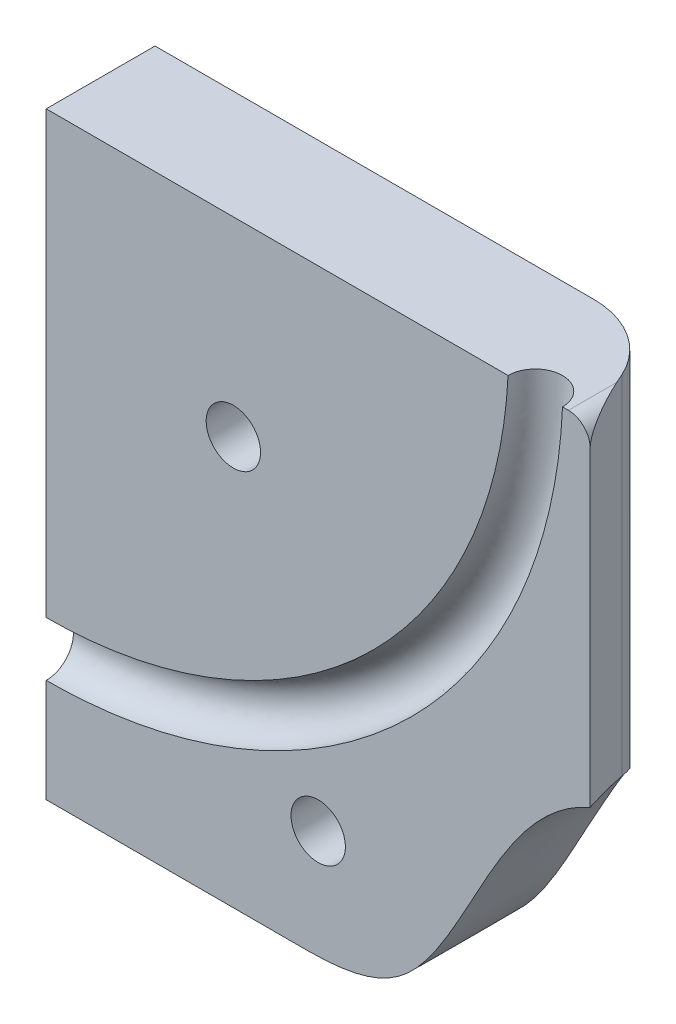
ISO-10303-21;
HEADER;
FILE_DESCRIPTION(('STEP AP214'),'2;1');
FILE_NAME('part.step','',(''),(''),'','','');
FILE_SCHEMA(('AUTOMOTIVE_DESIGN { 1 0 10303 214 1 1 1 1 }'));
ENDSEC;
DATA;
#1=APPLICATION_CONTEXT('core data for automotive mechanical design processes');
#2=APPLICATION_PROTOCOL_DEFINITION('international standard','automotive_design',2000,#1);
#3=PRODUCT_CONTEXT('',#1,'mechanical');
#4=PRODUCT('Part','Part','',(#3));
#5=PRODUCT_RELATED_PRODUCT_CATEGORY('part','',(#4));
#6=PRODUCT_DEFINITION_FORMATION('','',#4);
#7=PRODUCT_DEFINITION_CONTEXT('part definition',#1,'design');
#8=PRODUCT_DEFINITION('design','',#6,#7);
#9=PRODUCT_DEFINITION_SHAPE('','',#8);
#10=(LENGTH_UNIT() NAMED_UNIT(*) SI_UNIT(.MILLI.,.METRE.));
#11=(NAMED_UNIT(*) PLANE_ANGLE_UNIT() SI_UNIT($,.RADIAN.));
#12=(NAMED_UNIT(*) SI_UNIT($,.STERADIAN.) SOLID_ANGLE_UNIT());
#13=UNCERTAINTY_MEASURE_WITH_UNIT(LENGTH_MEASURE(1.E-05),#10,'distance_accuracy_value','');
#14=(GEOMETRIC_REPRESENTATION_CONTEXT(3) GLOBAL_UNCERTAINTY_ASSIGNED_CONTEXT((#13)) GLOBAL_UNIT_ASSIGNED_CONTEXT((#10,
#11,#12)) REPRESENTATION_CONTEXT('',''));
#15=CARTESIAN_POINT('',(0.,0.,0.));
#16=DIRECTION('',(0.,0.,1.));
#17=DIRECTION('',(1.,0.,0.));
#18=AXIS2_PLACEMENT_3D('',#15,#16,#17);
#19=CARTESIAN_POINT('',(38.2647547534457,10.0098254795269,0.));
#20=DIRECTION('',(0.,0.,1.));
#21=DIRECTION('',(-1.,0.,0.));
#22=AXIS2_PLACEMENT_3D('',#19,#20,#21);
#23=PLANE('',#22);
#24=CARTESIAN_POINT('',(17.2,37.5,0.));
#25=DIRECTION('',(0.,0.,-1.));
#26=DIRECTION('',(-1.,0.,0.));
#27=AXIS2_PLACEMENT_3D('',#24,#25,#26);
#28=CIRCLE('',#27,2.5000000000842);
#29=CARTESIAN_POINT('',(14.6999999999158,37.5,0.));
#30=VERTEX_POINT('',#29);
#31=EDGE_CURVE('E201',#30,#30,#28,.F.);
#32=ORIENTED_EDGE('',*,*,#31,.F.);
#33=EDGE_LOOP('',(#32));
#34=FACE_BOUND('',#33,.T.);
#35=CARTESIAN_POINT('',(42.5,57.,0.));
#36=CARTESIAN_POINT('',(42.5000000006538,51.9253380487951,0.));
#37=CARTESIAN_POINT('',(41.5531151539756,46.4013222350396,0.));
#38=CARTESIAN_POINT('',(38.3409411286107,38.4417646806979,0.));
#39=CARTESIAN_POINT('',(36.973235797455,35.8352441280092,0.));
#40=CARTESIAN_POINT('',(33.6915817568519,30.9261746060751,0.));
#41=CARTESIAN_POINT('',(31.771503076357,28.6150238978217,0.));
#42=CARTESIAN_POINT('',(27.4982759398184,24.4580256174074,0.));
#43=CARTESIAN_POINT('',(25.1383219375729,22.6054937700866,0.));
#44=CARTESIAN_POINT('',(20.1558797146555,19.4679096422306,0.));
#45=CARTESIAN_POINT('',(17.5261590397284,18.1774846024586,0.));
#46=CARTESIAN_POINT('',(12.1919874742694,16.1868966847282,0.));
#47=CARTESIAN_POINT('',(9.47903854419933,15.4827671330933,0.));
#48=CARTESIAN_POINT('',(4.15156445206141,14.6172527598869,0.));
#49=CARTESIAN_POINT('',(1.52516480725778,14.4582368787778,0.));
#50=CARTESIAN_POINT('',(-1.00015293756699,14.5108584228348,0.));
#51=B_SPLINE_CURVE_WITH_KNOTS('',3,(#35,#36,#37,#38,#39,#40,#41,#42,#43,#44,#45,#46,#47,#48,#49,
#50),.UNSPECIFIED.,.F.,.F.,(4,2,2,2,2,2,2,4),(0.,0.25,0.375,0.5,0.625,0.75,0.875,1.),.UNSPECIFIED.);
#52=CARTESIAN_POINT('',(0.,14.5012176124524,0.));
#53=VERTEX_POINT('',#52);
#54=CARTESIAN_POINT('',(42.4514698092519,55.,0.));
#55=VERTEX_POINT('',#54);
#56=EDGE_CURVE('E161',#53,#55,#51,.F.);
#57=ORIENTED_EDGE('',*,*,#56,.T.);
#58=DIRECTION('',(-1.,0.,0.));
#59=VECTOR('',#58,1.);
#60=CARTESIAN_POINT('',(0.,55.,0.));
#61=LINE('',#60,#59);
#62=CARTESIAN_POINT('',(0.,55.,0.));
#63=VERTEX_POINT('',#62);
#64=EDGE_CURVE('E118',#55,#63,#61,.T.);
#65=ORIENTED_EDGE('',*,*,#64,.T.);
#66=DIRECTION('',(0.,-1.,0.));
#67=VECTOR('',#66,1.);
#68=CARTESIAN_POINT('',(0.,0.,0.));
#69=LINE('',#68,#67);
#70=EDGE_CURVE('E145',#63,#53,#69,.T.);
#71=ORIENTED_EDGE('',*,*,#70,.T.);
#72=EDGE_LOOP('',(#57,#65,#71));
#73=FACE_BOUND('',#72,.T.);
#74=ADVANCED_FACE('F33',(#34,#73),#23,.T.);
#75=CARTESIAN_POINT('',(0.,0.,-10.));
#76=DIRECTION('',(0.,1.,0.));
#77=DIRECTION('',(0.,0.,-1.));
#78=AXIS2_PLACEMENT_3D('',#75,#76,#77);
#79=PLANE('',#78);
#80=DIRECTION('',(1.,0.,0.));
#81=VECTOR('',#80,1.);
#82=CARTESIAN_POINT('',(0.,0.,0.));
#83=LINE('',#82,#81);
#84=CARTESIAN_POINT('',(0.,0.,0.));
#85=VERTEX_POINT('',#84);
#86=CARTESIAN_POINT('',(24.,0.,0.));
#87=VERTEX_POINT('',#86);
#88=EDGE_CURVE('E131',#85,#87,#83,.T.);
#89=ORIENTED_EDGE('',*,*,#88,.F.);
#90=DIRECTION('',(0.,0.,1.));
#91=VECTOR('',#90,1.);
#92=CARTESIAN_POINT('',(0.,0.,-10.));
#93=LINE('',#92,#91);
#94=CARTESIAN_POINT('',(0.,0.,-10.));
#95=VERTEX_POINT('',#94);
#96=EDGE_CURVE('E149',#95,#85,#93,.T.);
#97=ORIENTED_EDGE('',*,*,#96,.F.);
#98=DIRECTION('',(1.,0.,0.));
#99=VECTOR('',#98,1.);
#100=CARTESIAN_POINT('',(0.,0.,-10.));
#101=LINE('',#100,#99);
#102=CARTESIAN_POINT('',(24.,0.,-10.));
#103=VERTEX_POINT('',#102);
#104=EDGE_CURVE('E148',#95,#103,#101,.T.);
#105=ORIENTED_EDGE('',*,*,#104,.T.);
#106=DIRECTION('',(0.,0.,1.));
#107=VECTOR('',#106,1.);
#108=CARTESIAN_POINT('',(24.,0.,-10.));
#109=LINE('',#108,#107);
#110=EDGE_CURVE('E155',#103,#87,#109,.T.);
#111=ORIENTED_EDGE('',*,*,#110,.T.);
#112=EDGE_LOOP('',(#89,#97,#105,#111));
#113=FACE_BOUND('',#112,.T.);
#114=ADVANCED_FACE('F248',(#113),#79,.F.);
#115=CARTESIAN_POINT('',(24.,0.,-10.));
#116=CARTESIAN_POINT('',(29.8352147172741,0.,-10.));
#117=CARTESIAN_POINT('',(38.1427017924434,5.23965862310339,-10.));
#118=CARTESIAN_POINT('',(42.219386104431,21.0249690236079,-10.));
#119=CARTESIAN_POINT('',(50.,24.39,-10.));
#120=B_SPLINE_CURVE_WITH_KNOTS('',3,(#115,#116,#117,#118,#119),.UNSPECIFIED.,.F.,.F.,(4,1,4),
(0.,0.308376464465962,1.),.UNSPECIFIED.);
#121=DIRECTION('',(0.,0.,1.));
#122=VECTOR('',#121,1.);
#123=SURFACE_OF_LINEAR_EXTRUSION('',#120,#122);
#124=CARTESIAN_POINT('',(40.3273151174776,13.7686554590392,-10.));
#125=VERTEX_POINT('',#124);
#126=EDGE_CURVE('E249',#103,#125,#120,.T.);
#127=ORIENTED_EDGE('',*,*,#126,.T.);
#128=CARTESIAN_POINT('',(40.3273151202155,13.7686554575069,-10.));
#129=CARTESIAN_POINT('',(40.4467285588433,13.9820245100957,-9.99998126805955));
#130=CARTESIAN_POINT('',(40.5668640420407,14.1950035748302,-9.99732535118046));
#131=CARTESIAN_POINT('',(40.8093358759297,14.6205184449713,-9.98639567757893));
#132=CARTESIAN_POINT('',(40.931678322104,14.833050279482,-9.97810284564586));
#133=CARTESIAN_POINT('',(41.1787522298561,15.2569606691702,-9.95552967897624));
#134=CARTESIAN_POINT('',(41.3034878570959,15.4683361959591,-9.94123778637958));
#135=CARTESIAN_POINT('',(41.5555293860955,15.8892118410067,-9.90618086646873));
#136=CARTESIAN_POINT('',(41.6828369799004,16.0987105845027,-9.88541143882596));
#137=CARTESIAN_POINT('',(41.9430890324445,16.5197922078681,-9.83627453652074));
#138=CARTESIAN_POINT('',(42.0760958876754,16.7313183332073,-9.80774883139704));
#139=CARTESIAN_POINT('',(42.3451692532027,17.1509179914526,-9.74257147194688));
#140=CARTESIAN_POINT('',(42.4812332014135,17.3589941788515,-9.70592640961936));
#141=CARTESIAN_POINT('',(42.7565717045996,17.7709289243029,-9.6236042420385));
#142=CARTESIAN_POINT('',(42.8958431236252,17.9747912605905,-9.57793565338594));
#143=CARTESIAN_POINT('',(43.1777048692401,18.3775240692896,-9.47647666980652));
#144=CARTESIAN_POINT('',(43.3202936282172,18.5763968107682,-9.42069097431611));
#145=CARTESIAN_POINT('',(43.6134257916959,18.9745965608049,-9.29573064830759));
#146=CARTESIAN_POINT('',(43.7640770032242,19.1737272412102,-9.22617899429437));
#147=CARTESIAN_POINT('',(44.0684406202107,19.5643439887571,-9.07339906649159));
#148=CARTESIAN_POINT('',(44.2221533476893,19.7558292452952,-8.99016934725068));
#149=CARTESIAN_POINT('',(44.5310410437315,20.1286635567275,-8.80886176008807));
#150=CARTESIAN_POINT('',(44.6862051179849,20.310057788981,-8.71085885044324));
#151=CARTESIAN_POINT('',(44.9974086704417,20.6619892371722,-8.49813263635197));
#152=CARTESIAN_POINT('',(45.1534479608748,20.8325286917407,-8.38341279567371));
#153=CARTESIAN_POINT('',(45.4403251212698,21.1354345853722,-8.15510373777022));
#154=CARTESIAN_POINT('',(45.5713108686385,21.2696145956098,-8.0441095140563));
#155=CARTESIAN_POINT('',(45.8310700266159,21.5279021152313,-7.80856342759619));
#156=CARTESIAN_POINT('',(45.9598434408666,21.6520096411982,-7.68401158717151));
#157=CARTESIAN_POINT('',(46.2132594758109,21.8890514959839,-7.42115780564348));
#158=CARTESIAN_POINT('',(46.337905926975,22.0019963904821,-7.28286912030821));
#159=CARTESIAN_POINT('',(46.5811645387497,22.2160292404636,-6.99251437516786));
#160=CARTESIAN_POINT('',(46.6997784366572,22.3171206206791,-6.84045231739974));
#161=CARTESIAN_POINT('',(46.8904135831682,22.4750661538659,-6.57631629973108));
#162=CARTESIAN_POINT('',(46.9647190695841,22.5353856095659,-6.46793567994489));
#163=CARTESIAN_POINT('',(47.1091025043075,22.6504620048562,-6.24557704218207));
#164=CARTESIAN_POINT('',(47.1791814042466,22.7052201984987,-6.13160029475764));
#165=CARTESIAN_POINT('',(47.3147006182162,22.8092814536906,-5.89803918517384));
#166=CARTESIAN_POINT('',(47.3801278569312,22.8585693410513,-5.7784404732983));
#167=CARTESIAN_POINT('',(47.5055960816484,22.9515567113142,-5.53428625440431));
#168=CARTESIAN_POINT('',(47.5656351265772,22.9952541826866,-5.40972898422809));
#169=CARTESIAN_POINT('',(47.6226871616163,23.0361576650075,-5.28291741863039));
#170=B_SPLINE_CURVE_WITH_KNOTS('',3,(#128,#129,#130,#131,#132,#133,#134,#135,#136,#137,#138,
#139,#140,#141,#142,#143,#144,#145,#146,#147,#148,#149,#150,#151,#152,#153,#154,#155,#156,#157,
#158,#159,#160,#161,#162,#163,#164,#165,#166,#167,#168,#169),.UNSPECIFIED.,.F.,.F.,(4,2,2,2,2,2,
2,2,2,2,2,2,2,2,2,2,2,2,2,2,4),(0.,0.733537810530458,1.46957033832542,2.20702747125606,
2.94498666987134,3.6993053316924,4.45301380172933,5.20601427435247,5.95866586696809,
6.73584086058093,7.51309803627344,8.28653652963438,9.05981499288392,9.71291916050243,
10.3660222528546,11.0185011262161,11.6707910176208,12.1043091195951,12.5377292461287,
12.9723230845311,13.4070728602437),.UNSPECIFIED.);
#171=CARTESIAN_POINT('',(47.6226871616163,23.0361576650075,-5.28291741863038));
#172=VERTEX_POINT('',#171);
#173=EDGE_CURVE('E11',#125,#172,#170,.T.);
#174=ORIENTED_EDGE('',*,*,#173,.T.);
#175=CARTESIAN_POINT('',(50.,24.39,0.));
#176=CARTESIAN_POINT('',(49.8711470832192,24.3342734517914,-0.286339815068479));
#177=CARTESIAN_POINT('',(49.7424810321156,24.2759661271607,-0.572264373076557));
#178=CARTESIAN_POINT('',(49.4857811495244,24.1541679793347,-1.14270855661241));
#179=CARTESIAN_POINT('',(49.3577466284827,24.0906857826721,-1.42722971448298));
#180=CARTESIAN_POINT('',(49.1023200134816,23.9584242603145,-1.99484441448534));
#181=CARTESIAN_POINT('',(48.9749272840933,23.8896522290607,-2.27793936868167));
#182=CARTESIAN_POINT('',(48.720794981955,23.7467006581557,-2.84267781787781));
#183=CARTESIAN_POINT('',(48.594054862088,23.6725268974887,-3.12432252869343));
#184=CARTESIAN_POINT('',(48.341238080692,23.5186635100879,-3.6861375984622));
#185=CARTESIAN_POINT('',(48.2151610009308,23.4389779664948,-3.9663088868205));
#186=CARTESIAN_POINT('',(47.9636802960152,23.2739863505393,-4.5251548977439));
#187=CARTESIAN_POINT('',(47.8382764266694,23.188682489425,-4.8038301629568));
#188=CARTESIAN_POINT('',(47.5881267216213,23.0123367967133,-5.35971839639712));
#189=CARTESIAN_POINT('',(47.4633810005463,22.9212939991558,-5.63693110989712));
#190=CARTESIAN_POINT('',(47.2145868725048,22.7333960670775,-6.18980694998936));
#191=CARTESIAN_POINT('',(47.0905386902949,22.6365391647553,-6.4654695771225));
#192=CARTESIAN_POINT('',(46.8431515821448,22.4369311811063,-7.0152187063448));
#193=CARTESIAN_POINT('',(46.7198131838181,22.3341762157254,-7.28930403595982));
#194=CARTESIAN_POINT('',(46.4738559992845,22.1227010482246,-7.83587555714547));
#195=CARTESIAN_POINT('',(46.3512380962562,22.0139747452747,-8.10835978609737));
#196=CARTESIAN_POINT('',(46.106730752299,21.7904962333877,-8.65170943933555));
#197=CARTESIAN_POINT('',(45.9848426011073,21.6757356440696,-8.92257199753941));
#198=CARTESIAN_POINT('',(45.7418003955538,21.4401493623928,-9.46266578765821));
#199=CARTESIAN_POINT('',(45.6206480810897,21.3193130112043,-9.73189315313395));
#200=CARTESIAN_POINT('',(45.5,21.1955568219506,-10.));
#201=B_SPLINE_CURVE_WITH_KNOTS('',3,(#175,#176,#177,#178,#179,#180,#181,#182,#183,#184,#185,
#186,#187,#188,#189,#190,#191,#192,#193,#194,#195,#196,#197,#198,#199,#200),.UNSPECIFIED.,.F.,
.F.,(4,2,2,2,2,2,2,2,2,2,2,2,4),(0.,0.956701567146893,1.91183970271127,2.86568357783072,
3.81852157406886,4.77066111326431,5.72242812480572,6.67435576481001,7.62657432279897,
8.57942730483532,9.53327259982554,10.4884795019383,11.4454249609775),.UNSPECIFIED.);
#202=CARTESIAN_POINT('',(50.,24.39,0.));
#203=VERTEX_POINT('',#202);
#204=EDGE_CURVE('E111',#203,#172,#201,.T.);
#205=ORIENTED_EDGE('',*,*,#204,.F.);
#206=CARTESIAN_POINT('',(24.,0.,0.));
#207=CARTESIAN_POINT('',(29.8352147172741,0.,0.));
#208=CARTESIAN_POINT('',(38.1427017924434,5.23965862310339,0.));
#209=CARTESIAN_POINT('',(42.219386104431,21.0249690236079,0.));
#210=CARTESIAN_POINT('',(50.,24.39,0.));
#211=B_SPLINE_CURVE_WITH_KNOTS('',3,(#206,#207,#208,#209,#210),.UNSPECIFIED.,.F.,.F.,(4,1,4),
(0.,0.308376464465962,1.),.UNSPECIFIED.);
#212=EDGE_CURVE('E119',#87,#203,#211,.T.);
#213=ORIENTED_EDGE('',*,*,#212,.F.);
#214=ORIENTED_EDGE('',*,*,#110,.F.);
#215=EDGE_LOOP('',(#127,#174,#205,#213,#214));
#216=FACE_BOUND('',#215,.T.);
#217=ADVANCED_FACE('F122',(#216),#123,.T.);
#218=CARTESIAN_POINT('',(0.,55.,-10.));
#219=DIRECTION('',(0.,-1.,0.));
#220=DIRECTION('',(0.,0.,1.));
#221=AXIS2_PLACEMENT_3D('',#218,#219,#220);
#222=PLANE('',#221);
#223=DIRECTION('',(0.410364677328798,0.,0.911921505175106));
#224=VECTOR('',#223,1.);
#225=CARTESIAN_POINT('',(50.,55.,0.));
#226=LINE('',#225,#224);
#227=CARTESIAN_POINT('',(47.6226871616163,55.,-5.28291741863038));
#228=VERTEX_POINT('',#227);
#229=CARTESIAN_POINT('',(48.,55.,-4.44444444444445));
#230=VERTEX_POINT('',#229);
#231=EDGE_CURVE('E126',#228,#230,#226,.T.);
#232=ORIENTED_EDGE('',*,*,#231,.F.);
#233=CARTESIAN_POINT('',(40.3273151202155,55.,-2.));
#234=DIRECTION('',(0.,-1.,0.));
#235=DIRECTION('',(0.,0.,-1.));
#236=AXIS2_PLACEMENT_3D('',#233,#234,#235);
#237=CIRCLE('',#236,8.);
#238=CARTESIAN_POINT('',(40.3273151202155,55.,-10.));
#239=VERTEX_POINT('',#238);
#240=EDGE_CURVE('E60',#228,#239,#237,.F.);
#241=ORIENTED_EDGE('',*,*,#240,.T.);
#242=DIRECTION('',(-1.,0.,0.));
#243=VECTOR('',#242,1.);
#244=CARTESIAN_POINT('',(0.,55.,-10.));
#245=LINE('',#244,#243);
#246=CARTESIAN_POINT('',(0.,55.,-10.));
#247=VERTEX_POINT('',#246);
#248=EDGE_CURVE('E254',#239,#247,#245,.T.);
#249=ORIENTED_EDGE('',*,*,#248,.T.);
#250=DIRECTION('',(0.,0.,1.));
#251=VECTOR('',#250,1.);
#252=CARTESIAN_POINT('',(0.,55.,-10.));
#253=LINE('',#252,#251);
#254=EDGE_CURVE('E152',#247,#63,#253,.T.);
#255=ORIENTED_EDGE('',*,*,#254,.T.);
#256=ORIENTED_EDGE('',*,*,#64,.F.);
#257=CARTESIAN_POINT('',(47.4568555946469,55.,0.));
#258=CARTESIAN_POINT('',(47.4568623708793,55.,-0.0702648939159161));
#259=CARTESIAN_POINT('',(47.4538904852355,55.,-0.140526573017456));
#260=CARTESIAN_POINT('',(47.442041824152,55.,-0.280546893510559));
#261=CARTESIAN_POINT('',(47.4331653421898,55.,-0.350305559729305));
#262=CARTESIAN_POINT('',(47.40956851912,55.,-0.488779823353157));
#263=CARTESIAN_POINT('',(47.3948524440054,55.,-0.557496144259975));
#264=CARTESIAN_POINT('',(47.3596963979197,55.,-0.693427968661049));
#265=CARTESIAN_POINT('',(47.3392564945323,55.,-0.760643489865761));
#266=CARTESIAN_POINT('',(47.2695183998098,55.,-0.959387102448081));
#267=CARTESIAN_POINT('',(47.211791561359,55.,-1.08807213968848));
#268=CARTESIAN_POINT('',(47.0756008847293,55.,-1.33383292830919));
#269=CARTESIAN_POINT('',(46.997140974646,55.,-1.45091087300155));
#270=CARTESIAN_POINT('',(46.8216505600416,55.,-1.67031486399083));
#271=CARTESIAN_POINT('',(46.7246120514826,55.,-1.77263451868155));
#272=CARTESIAN_POINT('',(46.5147354203153,55.,-1.95955877369636));
#273=CARTESIAN_POINT('',(46.4018948401067,55.,-2.04416061335896));
#274=CARTESIAN_POINT('',(46.1635226103419,55.,-2.19331465627374));
#275=CARTESIAN_POINT('',(46.0379799845037,55.,-2.25784931923312));
#276=CARTESIAN_POINT('',(45.7778572992051,55.,-2.36494364852608));
#277=CARTESIAN_POINT('',(45.643277768906,55.,-2.40750460027749));
#278=CARTESIAN_POINT('',(45.3687580828219,55.,-2.46949108001671));
#279=CARTESIAN_POINT('',(45.2288129372254,55.,-2.48889450599971));
#280=CARTESIAN_POINT('',(44.947642919291,55.,-2.50394296510746));
#281=CARTESIAN_POINT('',(44.806418012416,55.,-2.4995873551264));
#282=CARTESIAN_POINT('',(44.5266412821531,55.,-2.46724523838534));
#283=CARTESIAN_POINT('',(44.388090963704,55.,-2.43924580259765));
#284=CARTESIAN_POINT('',(44.1175940612239,55.,-2.36033921992151));
#285=CARTESIAN_POINT('',(43.9856474598996,55.,-2.30943213302506));
#286=CARTESIAN_POINT('',(43.7956666437165,55.,-2.21708326981605));
#287=CARTESIAN_POINT('',(43.7336358513023,55.,-2.18361629528253));
#288=CARTESIAN_POINT('',(43.6126124845674,55.,-2.11157533993583));
#289=CARTESIAN_POINT('',(43.55361920705,55.,-2.0730025485901));
#290=CARTESIAN_POINT('',(43.4391207612037,55.,-1.99103592660528));
#291=CARTESIAN_POINT('',(43.3836141388032,55.,-1.94764412686189));
#292=CARTESIAN_POINT('',(43.2764126780997,55.,-1.85630635516975));
#293=CARTESIAN_POINT('',(43.2247215862654,55.,-1.80835601013701));
#294=CARTESIAN_POINT('',(43.0761476337713,55.,-1.65834509604768));
#295=CARTESIAN_POINT('',(42.9855203926245,55.,-1.54994981940076));
#296=CARTESIAN_POINT('',(42.8238082500325,55.,-1.31945513463973));
#297=CARTESIAN_POINT('',(42.7527224116425,55.,-1.1973563839568));
#298=CARTESIAN_POINT('',(42.6622758114028,55.,-1.00667789322266));
#299=CARTESIAN_POINT('',(42.6348147232992,55.,-0.941830549025652));
#300=CARTESIAN_POINT('',(42.5854750549876,55.,-0.810087020293698));
#301=CARTESIAN_POINT('',(42.5635919564041,55.,-0.743192543529586));
#302=CARTESIAN_POINT('',(42.5255682313005,55.,-0.607869056184087));
#303=CARTESIAN_POINT('',(42.509421937976,55.,-0.53944163129186));
#304=CARTESIAN_POINT('',(42.4829572604698,55.,-0.401481732782834));
#305=CARTESIAN_POINT('',(42.4726371580063,55.,-0.331949591199617));
#306=CARTESIAN_POINT('',(42.460666972768,55.,-0.21855461096321));
#307=CARTESIAN_POINT('',(42.4572158538575,55.,-0.174873913796269));
#308=CARTESIAN_POINT('',(42.4526189346255,55.,-0.0874636896438956));
#309=CARTESIAN_POINT('',(42.4514693388725,55.,-0.0437343622368296));
#310=CARTESIAN_POINT('',(42.4514698092519,55.,0.));
#311=B_SPLINE_CURVE_WITH_KNOTS('',3,(#257,#258,#259,#260,#261,#262,#263,#264,#265,#266,#267,
#268,#269,#270,#271,#272,#273,#274,#275,#276,#277,#278,#279,#280,#281,#282,#283,#284,#285,#286,
#287,#288,#289,#290,#291,#292,#293,#294,#295,#296,#297,#298,#299,#300,#301,#302,#303,#304,#305,
#306,#307,#308,#309,#310),.UNSPECIFIED.,.F.,.F.,(4,2,2,2,2,2,2,2,2,2,2,2,2,2,2,2,2,2,2,2,2,2,2,
2,2,2,4),(0.,0.210726062439781,0.421441651895574,0.632003590030021,0.842563042076186,
1.26350193366707,1.68436113112706,2.10540205295756,2.52650852960349,2.94798205847605,
3.36943092920193,3.79128171829109,4.21314392602706,4.6352369679275,5.05732890443031,
5.26857170865013,5.47976538739624,5.69087039721725,5.90218000719581,6.32391093804175,
6.74562164477232,6.95667878086567,7.16756440573312,7.37824113524605,7.58885569869703,
7.72025052778673,7.85142849517873),.UNSPECIFIED.);
#312=CARTESIAN_POINT('',(47.4568555946469,55.,0.));
#313=VERTEX_POINT('',#312);
#314=EDGE_CURVE('E133',#313,#55,#311,.T.);
#315=ORIENTED_EDGE('',*,*,#314,.F.);
#316=CARTESIAN_POINT('',(48.,55.,0.));
#317=VERTEX_POINT('',#316);
#318=EDGE_CURVE('E142',#317,#313,#61,.T.);
#319=ORIENTED_EDGE('',*,*,#318,.F.);
#320=DIRECTION('',(0.,0.,1.));
#321=VECTOR('',#320,1.);
#322=CARTESIAN_POINT('',(48.,55.,-10.));
#323=LINE('',#322,#321);
#324=EDGE_CURVE('E179',#317,#230,#323,.F.);
#325=ORIENTED_EDGE('',*,*,#324,.T.);
#326=EDGE_LOOP('',(#232,#241,#249,#255,#256,#315,#319,#325));
#327=FACE_BOUND('',#326,.T.);
#328=ADVANCED_FACE('F186',(#327),#222,.F.);
#329=CARTESIAN_POINT('',(0.,0.,-10.));
#330=DIRECTION('',(1.,0.,0.));
#331=DIRECTION('',(0.,0.,1.));
#332=AXIS2_PLACEMENT_3D('',#329,#330,#331);
#333=PLANE('',#332);
#334=ORIENTED_EDGE('',*,*,#70,.F.);
#335=ORIENTED_EDGE('',*,*,#254,.F.);
#336=DIRECTION('',(0.,-1.,0.));
#337=VECTOR('',#336,1.);
#338=CARTESIAN_POINT('',(0.,0.,-10.));
#339=LINE('',#338,#337);
#340=EDGE_CURVE('E153',#247,#95,#339,.T.);
#341=ORIENTED_EDGE('',*,*,#340,.T.);
#342=ORIENTED_EDGE('',*,*,#96,.T.);
#343=CARTESIAN_POINT('',(0.,9.50123213656066,0.));
#344=VERTEX_POINT('',#343);
#345=EDGE_CURVE('E144',#344,#85,#69,.T.);
#346=ORIENTED_EDGE('',*,*,#345,.F.);
#347=CARTESIAN_POINT('',(-2.67825041658232E-13,9.50123213656066,0.));
#348=CARTESIAN_POINT('',(0.,9.50122540068782,-0.070314845686527));
#349=CARTESIAN_POINT('',(0.,9.50419861037009,-0.14062649626872));
#350=CARTESIAN_POINT('',(0.,9.5160527904368,-0.280746762836435));
#351=CARTESIAN_POINT('',(0.,9.52493347798262,-0.350555402743394));
#352=CARTESIAN_POINT('',(0.,9.54854219323776,-0.48913111560415));
#353=CARTESIAN_POINT('',(0.,9.56326610684729,-0.557898886123407));
#354=CARTESIAN_POINT('',(0.,9.59844182404334,-0.693932821425435));
#355=CARTESIAN_POINT('',(0.,9.61889355801923,-0.761199004446385));
#356=CARTESIAN_POINT('',(0.,9.68867455696585,-0.960093953412169));
#357=CARTESIAN_POINT('',(0.,9.74643966872951,-1.08887779485323));
#358=CARTESIAN_POINT('',(0.,9.88273128258306,-1.33482222990012));
#359=CARTESIAN_POINT('',(0.,9.96125370542873,-1.45198510105415));
#360=CARTESIAN_POINT('',(0.,10.1368617274998,-1.67148821351709));
#361=CARTESIAN_POINT('',(0.,10.2339477113285,-1.77382814764447));
#362=CARTESIAN_POINT('',(0.,10.443936115069,-1.96076659634398));
#363=CARTESIAN_POINT('',(0.,10.5568409412639,-2.04536240687104));
#364=CARTESIAN_POINT('',(0.,10.7952462054564,-2.19439442310009));
#365=CARTESIAN_POINT('',(0.,10.9207460517352,-2.25883157527817));
#366=CARTESIAN_POINT('',(0.,11.1807746204466,-2.36571686347314));
#367=CARTESIAN_POINT('',(0.,11.3153027645486,-2.40816640644638));
#368=CARTESIAN_POINT('',(0.,11.5895774762622,-2.4698797774023));
#369=CARTESIAN_POINT('',(0.,11.7293241372498,-2.4891431903055));
#370=CARTESIAN_POINT('',(0.,12.0100758484459,-2.50393246704834));
#371=CARTESIAN_POINT('',(0.,12.1510809275123,-2.49945778512623));
#372=CARTESIAN_POINT('',(0.,12.43031969686,-2.4669104771072));
#373=CARTESIAN_POINT('',(0.,12.5685534179945,-2.43883811386974));
#374=CARTESIAN_POINT('',(0.,12.8384095386283,-2.35984198446587));
#375=CARTESIAN_POINT('',(0.,12.9700319590935,-2.30891829077115));
#376=CARTESIAN_POINT('',(0.,13.1595382852102,-2.21658890833924));
#377=CARTESIAN_POINT('',(0.,13.2214156954607,-2.18313377497947));
#378=CARTESIAN_POINT('',(0.,13.3421356792443,-2.11113212448887));
#379=CARTESIAN_POINT('',(0.,13.4009789520708,-2.07258678788258));
#380=CARTESIAN_POINT('',(0.,13.5151834436357,-1.99069126435227));
#381=CARTESIAN_POINT('',(0.,13.5705461002822,-1.9473430822921));
#382=CARTESIAN_POINT('',(0.,13.6774678461422,-1.85610944315271));
#383=CARTESIAN_POINT('',(0.,13.7290232131766,-1.80821964776341));
#384=CARTESIAN_POINT('',(0.,13.8772845283559,-1.65833787530844));
#385=CARTESIAN_POINT('',(0.,13.9677389070811,-1.5500234145117));
#386=CARTESIAN_POINT('',(0.,14.1291463966875,-1.31973259465839));
#387=CARTESIAN_POINT('',(0.,14.2001002487879,-1.19775675512193));
#388=CARTESIAN_POINT('',(0.,14.2904289698735,-1.00721627801829));
#389=CARTESIAN_POINT('',(0.,14.317875017014,-0.942368552254907));
#390=CARTESIAN_POINT('',(0.,14.3671892197706,-0.810627155980245));
#391=CARTESIAN_POINT('',(0.,14.3890618930775,-0.743735192075532));
#392=CARTESIAN_POINT('',(0.,14.4270710425265,-0.608418429803441));
#393=CARTESIAN_POINT('',(0.,14.4432131325722,-0.539995201784398));
#394=CARTESIAN_POINT('',(0.,14.4696765318646,-0.402044968812576));
#395=CARTESIAN_POINT('',(0.,14.4799995461119,-0.33251829331721));
#396=CARTESIAN_POINT('',(0.,14.4919912022806,-0.219033646511648));
#397=CARTESIAN_POINT('',(0.,14.4954533076615,-0.175257277195341));
#398=CARTESIAN_POINT('',(0.,14.5000648408243,-0.0876554795082916));
#399=CARTESIAN_POINT('',(0.,14.5012180823707,-0.0438302518781351));
#400=CARTESIAN_POINT('',(0.,14.5012176124524,0.));
#401=B_SPLINE_CURVE_WITH_KNOTS('',3,(#347,#348,#349,#350,#351,#352,#353,#354,#355,#356,#357,
#358,#359,#360,#361,#362,#363,#364,#365,#366,#367,#368,#369,#370,#371,#372,#373,#374,#375,#376,
#377,#378,#379,#380,#381,#382,#383,#384,#385,#386,#387,#388,#389,#390,#391,#392,#393,#394,#395,
#396,#397,#398,#399,#400),.UNSPECIFIED.,.F.,.F.,(4,2,2,2,2,2,2,2,2,2,2,2,2,2,2,2,2,2,2,2,2,2,2,
2,2,2,4),(0.,0.210875936412851,0.421741777220032,0.632459414220221,0.843174490464591,
1.26442830267909,1.68559939120475,2.10677920657592,2.52802315941138,2.94924733130775,
3.37044454632755,3.79164930153276,4.21286374068446,4.63407348790331,5.05528189928875,
5.26610358899045,5.47687647032262,5.68756169734462,5.8984502453841,6.3196685447673,
6.74087083133631,6.95191170092845,7.16278095592447,7.37344306136853,7.58404341027272,
7.71572669780885,7.84719229179057),.UNSPECIFIED.);
#402=EDGE_CURVE('E204',#344,#53,#401,.T.);
#403=ORIENTED_EDGE('',*,*,#402,.T.);
#404=EDGE_LOOP('',(#334,#335,#341,#342,#346,#403));
#405=FACE_BOUND('',#404,.T.);
#406=ADVANCED_FACE('F235',(#405),#333,.F.);
#407=CARTESIAN_POINT('',(38.2647547534457,10.0098254795269,-10.));
#408=DIRECTION('',(0.,0.,1.));
#409=DIRECTION('',(-1.,0.,0.));
#410=AXIS2_PLACEMENT_3D('',#407,#408,#409);
#411=PLANE('',#410);
#412=CARTESIAN_POINT('',(25.,10.,-10.));
#413=DIRECTION('',(0.,0.,-1.));
#414=DIRECTION('',(-1.,0.,0.));
#415=AXIS2_PLACEMENT_3D('',#412,#413,#414);
#416=CIRCLE('',#415,2.50000000000001);
#417=CARTESIAN_POINT('',(22.5,10.,-10.));
#418=VERTEX_POINT('',#417);
#419=EDGE_CURVE('E177',#418,#418,#416,.T.);
#420=ORIENTED_EDGE('',*,*,#419,.F.);
#421=EDGE_LOOP('',(#420));
#422=FACE_BOUND('',#421,.T.);
#423=CARTESIAN_POINT('',(17.2,37.5,-10.));
#424=DIRECTION('',(0.,0.,1.));
#425=DIRECTION('',(1.,0.,0.));
#426=AXIS2_PLACEMENT_3D('',#423,#424,#425);
#427=CIRCLE('',#426,2.5000000000842);
#428=CARTESIAN_POINT('',(19.7000000000842,37.5,-10.));
#429=VERTEX_POINT('',#428);
#430=EDGE_CURVE('E176',#429,#429,#427,.T.);
#431=ORIENTED_EDGE('',*,*,#430,.T.);
#432=EDGE_LOOP('',(#431));
#433=FACE_BOUND('',#432,.T.);
#434=ORIENTED_EDGE('',*,*,#248,.F.);
#435=DIRECTION('',(0.,1.,0.));
#436=VECTOR('',#435,1.);
#437=CARTESIAN_POINT('',(40.3273151202155,10.0098254795269,-10.));
#438=LINE('',#437,#436);
#439=EDGE_CURVE('E46',#239,#125,#438,.F.);
#440=ORIENTED_EDGE('',*,*,#439,.T.);
#441=ORIENTED_EDGE('',*,*,#126,.F.);
#442=ORIENTED_EDGE('',*,*,#104,.F.);
#443=ORIENTED_EDGE('',*,*,#340,.F.);
#444=EDGE_LOOP('',(#434,#440,#441,#442,#443));
#445=FACE_BOUND('',#444,.T.);
#446=ADVANCED_FACE('F226',(#422,#433,#445),#411,.F.);
#447=CARTESIAN_POINT('',(25.,10.,0.));
#448=DIRECTION('',(0.,0.,1.));
#449=DIRECTION('',(1.,0.,0.));
#450=AXIS2_PLACEMENT_3D('',#447,#448,#449);
#451=CIRCLE('',#450,2.50000000000001);
#452=CARTESIAN_POINT('',(27.5,10.,0.));
#453=VERTEX_POINT('',#452);
#454=EDGE_CURVE('E170',#453,#453,#451,.T.);
#455=ORIENTED_EDGE('',*,*,#454,.F.);
#456=EDGE_LOOP('',(#455));
#457=FACE_BOUND('',#456,.T.);
#458=DIRECTION('',(0.,1.,0.));
#459=VECTOR('',#458,1.);
#460=CARTESIAN_POINT('',(50.,55.,0.));
#461=LINE('',#460,#459);
#462=CARTESIAN_POINT('',(50.,53.,0.));
#463=VERTEX_POINT('',#462);
#464=EDGE_CURVE('E107',#203,#463,#461,.T.);
#465=ORIENTED_EDGE('',*,*,#464,.T.);
#466=CARTESIAN_POINT('',(48.,53.,0.));
#467=DIRECTION('',(0.,0.,1.));
#468=DIRECTION('',(1.,0.,0.));
#469=AXIS2_PLACEMENT_3D('',#466,#467,#468);
#470=CIRCLE('',#469,2.);
#471=EDGE_CURVE('E169',#463,#317,#470,.T.);
#472=ORIENTED_EDGE('',*,*,#471,.T.);
#473=ORIENTED_EDGE('',*,*,#318,.T.);
#474=CARTESIAN_POINT('',(47.5,57.,0.));
#475=CARTESIAN_POINT('',(47.5000000006342,51.3140978450396,0.));
#476=CARTESIAN_POINT('',(46.4463996404609,45.1660225579919,0.));
#477=CARTESIAN_POINT('',(42.8492987330856,36.252641083718,0.));
#478=CARTESIAN_POINT('',(41.3251219726072,33.3484048785011,0.));
#479=CARTESIAN_POINT('',(37.6532035292652,27.855533706652,0.));
#480=CARTESIAN_POINT('',(35.5121807572972,25.2783911134872,0.));
#481=CARTESIAN_POINT('',(30.7305134372518,20.6267818741217,0.));
#482=CARTESIAN_POINT('',(28.0989065297316,18.5610554449711,0.));
#483=CARTESIAN_POINT('',(22.5240247286413,15.0503954276187,0.));
#484=CARTESIAN_POINT('',(19.5908869403394,13.6111847661828,0.));
#485=CARTESIAN_POINT('',(13.6235121047169,11.3843002018495,0.));
#486=CARTESIAN_POINT('',(10.6001106066956,10.5993438344969,0.));
#487=CARTESIAN_POINT('',(4.63409274206645,9.63009016353973,0.));
#488=CARTESIAN_POINT('',(1.70053245613362,9.45349724357452,0.));
#489=CARTESIAN_POINT('',(-1.10431829054586,9.51194358266815,0.));
#490=B_SPLINE_CURVE_WITH_KNOTS('',3,(#474,#475,#476,#477,#478,#479,#480,#481,#482,#483,#484,
#485,#486,#487,#488,#489),.UNSPECIFIED.,.F.,.F.,(4,2,2,2,2,2,2,4),(0.,0.25,0.375,0.5,0.625,0.75,
0.875,1.),.UNSPECIFIED.);
#491=EDGE_CURVE('E157',#313,#344,#490,.T.);
#492=ORIENTED_EDGE('',*,*,#491,.T.);
#493=ORIENTED_EDGE('',*,*,#345,.T.);
#494=ORIENTED_EDGE('',*,*,#88,.T.);
#495=ORIENTED_EDGE('',*,*,#212,.T.);
#496=EDGE_LOOP('',(#465,#472,#473,#492,#493,#494,#495));
#497=FACE_BOUND('',#496,.T.);
#498=ADVANCED_FACE('F129',(#457,#497),#23,.T.);
#499=CARTESIAN_POINT('',(47.5,57.,0.));
#500=CARTESIAN_POINT('',(47.5000000006342,51.3140978450396,0.));
#501=CARTESIAN_POINT('',(46.4463996404609,45.1660225579919,0.));
#502=CARTESIAN_POINT('',(42.8492987330856,36.252641083718,0.));
#503=CARTESIAN_POINT('',(41.3251219726072,33.3484048785011,0.));
#504=CARTESIAN_POINT('',(37.6532035292652,27.855533706652,0.));
#505=CARTESIAN_POINT('',(35.5121807572972,25.2783911134872,0.));
#506=CARTESIAN_POINT('',(30.7305134372518,20.6267818741217,0.));
#507=CARTESIAN_POINT('',(28.0989065297316,18.5610554449711,0.));
#508=CARTESIAN_POINT('',(22.5240247286413,15.0503954276187,0.));
#509=CARTESIAN_POINT('',(19.5908869403394,13.6111847661828,0.));
#510=CARTESIAN_POINT('',(13.6235121047169,11.3843002018495,0.));
#511=CARTESIAN_POINT('',(10.6001106066956,10.5993438344969,0.));
#512=CARTESIAN_POINT('',(4.63409274206645,9.63009016353973,0.));
#513=CARTESIAN_POINT('',(1.70053245613362,9.45349724357452,0.));
#514=CARTESIAN_POINT('',(-1.10431829054586,9.51194358266815,0.));
#515=CARTESIAN_POINT('',(47.5,57.,-5.));
#516=CARTESIAN_POINT('',(47.5000000006342,51.3140978450396,-5.));
#517=CARTESIAN_POINT('',(46.4463996404188,45.1660225579919,-5.));
#518=CARTESIAN_POINT('',(42.8492987331067,36.252641083718,-5.));
#519=CARTESIAN_POINT('',(41.3251219726073,33.3484048785011,-5.));
#520=CARTESIAN_POINT('',(37.6532035292652,27.855533706652,-5.));
#521=CARTESIAN_POINT('',(35.5121807572972,25.2783911134872,-5.));
#522=CARTESIAN_POINT('',(30.7305134372518,20.6267818741217,-5.));
#523=CARTESIAN_POINT('',(28.0989065297532,18.5610554449602,-5.));
#524=CARTESIAN_POINT('',(22.5240247286196,15.0503954276295,-5.));
#525=CARTESIAN_POINT('',(19.5908869403185,13.6111847661828,-5.));
#526=CARTESIAN_POINT('',(13.6235121047378,11.3843002018495,-5.));
#527=CARTESIAN_POINT('',(10.6001106067154,10.5993438344969,-5.));
#528=CARTESIAN_POINT('',(4.6340927420466,9.63009016353972,-5.));
#529=CARTESIAN_POINT('',(1.70053245614852,9.45349724357421,-5.));
#530=CARTESIAN_POINT('',(-1.10431829054586,9.51194358266814,-5.));
#531=CARTESIAN_POINT('',(42.5,57.,-5.));
#532=CARTESIAN_POINT('',(42.5000000006538,51.9253380487952,-5.));
#533=CARTESIAN_POINT('',(41.5531151539756,46.4013222350396,-5.));
#534=CARTESIAN_POINT('',(38.3409411286107,38.4417646806979,-5.));
#535=CARTESIAN_POINT('',(36.973235797455,35.8352441280092,-5.));
#536=CARTESIAN_POINT('',(33.6915817568519,30.9261746060751,-5.));
#537=CARTESIAN_POINT('',(31.771503076357,28.6150238978217,-5.));
#538=CARTESIAN_POINT('',(27.4982759398184,24.4580256174074,-5.));
#539=CARTESIAN_POINT('',(25.1383219375729,22.6054937700866,-5.));
#540=CARTESIAN_POINT('',(20.1558797146555,19.4679096422306,-5.));
#541=CARTESIAN_POINT('',(17.5261590397284,18.1774846024586,-5.));
#542=CARTESIAN_POINT('',(12.1919874742694,16.1868966847282,-5.));
#543=CARTESIAN_POINT('',(9.47903854419933,15.4827671330933,-5.));
#544=CARTESIAN_POINT('',(4.15156445206141,14.6172527598869,-5.));
#545=CARTESIAN_POINT('',(1.52516480725778,14.4582368787778,-5.));
#546=CARTESIAN_POINT('',(-1.00015293756699,14.5108584228348,-5.));
#547=CARTESIAN_POINT('',(42.5,57.,0.));
#548=CARTESIAN_POINT('',(42.5000000006538,51.9253380487951,0.));
#549=CARTESIAN_POINT('',(41.5531151539756,46.4013222350396,0.));
#550=CARTESIAN_POINT('',(38.3409411286107,38.4417646806979,0.));
#551=CARTESIAN_POINT('',(36.973235797455,35.8352441280092,0.));
#552=CARTESIAN_POINT('',(33.6915817568519,30.9261746060751,0.));
#553=CARTESIAN_POINT('',(31.771503076357,28.6150238978217,0.));
#554=CARTESIAN_POINT('',(27.4982759398184,24.4580256174074,0.));
#555=CARTESIAN_POINT('',(25.1383219375729,22.6054937700866,0.));
#556=CARTESIAN_POINT('',(20.1558797146555,19.4679096422306,0.));
#557=CARTESIAN_POINT('',(17.5261590397284,18.1774846024586,0.));
#558=CARTESIAN_POINT('',(12.1919874742694,16.1868966847282,0.));
#559=CARTESIAN_POINT('',(9.47903854419933,15.4827671330933,0.));
#560=CARTESIAN_POINT('',(4.15156445206141,14.6172527598869,0.));
#561=CARTESIAN_POINT('',(1.52516480725778,14.4582368787778,0.));
#562=CARTESIAN_POINT('',(-1.00015293756699,14.5108584228348,0.));
#563=(BOUNDED_SURFACE() B_SPLINE_SURFACE(3,3,((#499,#500,#501,#502,#503,#504,#505,#506,#507,
#508,#509,#510,#511,#512,#513,#514),(#515,#516,#517,#518,#519,#520,#521,#522,#523,#524,#525,
#526,#527,#528,#529,#530),(#531,#532,#533,#534,#535,#536,#537,#538,#539,#540,#541,#542,#543,
#544,#545,#546),(#547,#548,#549,#550,#551,#552,#553,#554,#555,#556,#557,#558,#559,#560,#561,
#562)),.UNSPECIFIED.,.F.,.F.,.F.) B_SPLINE_SURFACE_WITH_KNOTS((4,4),(4,2,2,2,2,2,2,4),(0.,1.),
(0.,0.25,0.375,0.5,0.625,0.75,0.875,1.),
.UNSPECIFIED.) GEOMETRIC_REPRESENTATION_ITEM() RATIONAL_B_SPLINE_SURFACE(((1.,1.,1.,1.,1.,1.,1.,
1.,1.,1.,1.,1.,1.,1.,1.,1.),(0.333333333333333,0.333333333333333,0.333333333333333,
0.333333333333333,0.333333333333333,0.333333333333333,0.333333333333333,0.333333333333333,
0.333333333333333,0.333333333333333,0.333333333333333,0.333333333333333,0.333333333333333,
0.333333333333333,0.333333333333333,0.333333333333333),(0.333333333333333,0.333333333333333,
0.333333333333333,0.333333333333333,0.333333333333333,0.333333333333333,0.333333333333333,
0.333333333333333,0.333333333333333,0.333333333333333,0.333333333333333,0.333333333333333,
0.333333333333333,0.333333333333333,0.333333333333333,0.333333333333333),(1.,1.,1.,1.,1.,1.,1.,
1.,1.,1.,1.,1.,1.,1.,1.,1.))) REPRESENTATION_ITEM('') SURFACE());
#564=ORIENTED_EDGE('',*,*,#491,.F.);
#565=ORIENTED_EDGE('',*,*,#314,.T.);
#566=ORIENTED_EDGE('',*,*,#56,.F.);
#567=ORIENTED_EDGE('',*,*,#402,.F.);
#568=EDGE_LOOP('',(#564,#565,#566,#567));
#569=FACE_BOUND('',#568,.T.);
#570=ADVANCED_FACE('F218',(#569),#563,.T.);
#571=CARTESIAN_POINT('',(17.2,37.5,7.07106781210364));
#572=DIRECTION('',(0.,0.,-1.));
#573=DIRECTION('',(1.,0.,0.));
#574=AXIS2_PLACEMENT_3D('',#571,#572,#573);
#575=CYLINDRICAL_SURFACE('',#574,2.5000000000842);
#576=ORIENTED_EDGE('',*,*,#430,.F.);
#577=EDGE_LOOP('',(#576));
#578=FACE_BOUND('',#577,.T.);
#579=ORIENTED_EDGE('',*,*,#31,.T.);
#580=EDGE_LOOP('',(#579));
#581=FACE_BOUND('',#580,.T.);
#582=ADVANCED_FACE('F224',(#578,#581),#575,.F.);
#583=CARTESIAN_POINT('',(25.,10.,17.0710678118655));
#584=DIRECTION('',(0.,0.,-1.));
#585=DIRECTION('',(-1.,0.,0.));
#586=AXIS2_PLACEMENT_3D('',#583,#584,#585);
#587=CYLINDRICAL_SURFACE('',#586,2.50000000000001);
#588=ORIENTED_EDGE('',*,*,#454,.T.);
#589=EDGE_LOOP('',(#588));
#590=FACE_BOUND('',#589,.T.);
#591=ORIENTED_EDGE('',*,*,#419,.T.);
#592=EDGE_LOOP('',(#591));
#593=FACE_BOUND('',#592,.T.);
#594=ADVANCED_FACE('F286',(#590,#593),#587,.F.);
#595=CARTESIAN_POINT('',(48.,53.,-10.));
#596=DIRECTION('',(0.,0.,1.));
#597=DIRECTION('',(1.,0.,0.));
#598=AXIS2_PLACEMENT_3D('',#595,#596,#597);
#599=CYLINDRICAL_SURFACE('',#598,2.);
#600=CARTESIAN_POINT('',(48.,53.,-4.44444444444445));
#601=DIRECTION('',(-0.911921505175107,0.,0.410364677328798));
#602=DIRECTION('',(0.410364677328798,0.,0.911921505175107));
#603=AXIS2_PLACEMENT_3D('',#600,#601,#602);
#604=ELLIPSE('',#603,4.87371382210252,2.);
#605=EDGE_CURVE('E114',#230,#463,#604,.F.);
#606=ORIENTED_EDGE('',*,*,#605,.F.);
#607=ORIENTED_EDGE('',*,*,#324,.F.);
#608=ORIENTED_EDGE('',*,*,#471,.F.);
#609=EDGE_LOOP('',(#606,#607,#608));
#610=FACE_BOUND('',#609,.T.);
#611=ADVANCED_FACE('F270',(#610),#599,.T.);
#612=CARTESIAN_POINT('',(50.,-0.001000000000001,0.));
#613=DIRECTION('',(-0.911921505175107,0.,0.410364677328798));
#614=DIRECTION('',(0.410364677328798,0.,0.911921505175107));
#615=AXIS2_PLACEMENT_3D('',#612,#613,#614);
#616=PLANE('',#615);
#617=ORIENTED_EDGE('',*,*,#204,.T.);
#618=DIRECTION('',(0.,1.,0.));
#619=VECTOR('',#618,1.);
#620=CARTESIAN_POINT('',(47.6226871616163,-0.001000000000001,-5.28291741863038));
#621=LINE('',#620,#619);
#622=EDGE_CURVE('E183',#172,#228,#621,.T.);
#623=ORIENTED_EDGE('',*,*,#622,.T.);
#624=ORIENTED_EDGE('',*,*,#231,.T.);
#625=ORIENTED_EDGE('',*,*,#605,.T.);
#626=ORIENTED_EDGE('',*,*,#464,.F.);
#627=EDGE_LOOP('',(#617,#623,#624,#625,#626));
#628=FACE_BOUND('',#627,.T.);
#629=ADVANCED_FACE('F109',(#628),#616,.F.);
#630=CARTESIAN_POINT('',(40.3273151202155,-0.001000000000001,-2.));
#631=DIRECTION('',(0.,1.,0.));
#632=DIRECTION('',(0.,0.,1.));
#633=AXIS2_PLACEMENT_3D('',#630,#631,#632);
#634=CYLINDRICAL_SURFACE('',#633,8.);
#635=ORIENTED_EDGE('',*,*,#173,.F.);
#636=ORIENTED_EDGE('',*,*,#439,.F.);
#637=ORIENTED_EDGE('',*,*,#240,.F.);
#638=ORIENTED_EDGE('',*,*,#622,.F.);
#639=EDGE_LOOP('',(#635,#636,#637,#638));
#640=FACE_BOUND('',#639,.T.);
#641=ADVANCED_FACE('F35',(#640),#634,.T.);
#642=CLOSED_SHELL('',(#74,#114,#217,#328,#406,#446,#498,#570,#582,#594,#611,#629,#641));
#643=MANIFOLD_SOLID_BREP('B2',#642);
#644=ADVANCED_BREP_SHAPE_REPRESENTATION('',(#18,#643),#14);
#645=SHAPE_DEFINITION_REPRESENTATION(#9,#644);
ENDSEC;
END-ISO-10303-21;
